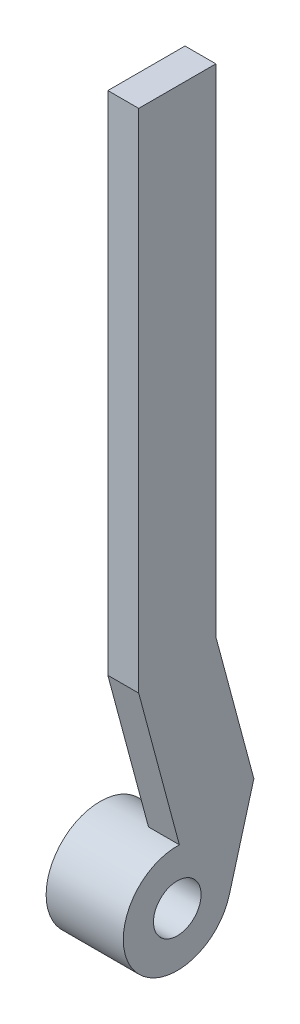
ISO-10303-21;
HEADER;
FILE_DESCRIPTION(('STEP AP214'),'2;1');
FILE_NAME('part.step','',(''),(''),'','','');
FILE_SCHEMA(('AUTOMOTIVE_DESIGN { 1 0 10303 214 1 1 1 1 }'));
ENDSEC;
DATA;
#1=APPLICATION_CONTEXT('core data for automotive mechanical design processes');
#2=APPLICATION_PROTOCOL_DEFINITION('international standard','automotive_design',2000,#1);
#3=PRODUCT_CONTEXT('',#1,'mechanical');
#4=PRODUCT('Part','Part','',(#3));
#5=PRODUCT_RELATED_PRODUCT_CATEGORY('part','',(#4));
#6=PRODUCT_DEFINITION_FORMATION('','',#4);
#7=PRODUCT_DEFINITION_CONTEXT('part definition',#1,'design');
#8=PRODUCT_DEFINITION('design','',#6,#7);
#9=PRODUCT_DEFINITION_SHAPE('','',#8);
#10=(LENGTH_UNIT() NAMED_UNIT(*) SI_UNIT(.MILLI.,.METRE.));
#11=(NAMED_UNIT(*) PLANE_ANGLE_UNIT() SI_UNIT($,.RADIAN.));
#12=(NAMED_UNIT(*) SI_UNIT($,.STERADIAN.) SOLID_ANGLE_UNIT());
#13=UNCERTAINTY_MEASURE_WITH_UNIT(LENGTH_MEASURE(1.E-05),#10,'distance_accuracy_value','');
#14=(GEOMETRIC_REPRESENTATION_CONTEXT(3) GLOBAL_UNCERTAINTY_ASSIGNED_CONTEXT((#13)) GLOBAL_UNIT_ASSIGNED_CONTEXT((#10,
#11,#12)) REPRESENTATION_CONTEXT('',''));
#15=CARTESIAN_POINT('',(0.,0.,0.));
#16=DIRECTION('',(0.,0.,1.));
#17=DIRECTION('',(1.,0.,0.));
#18=AXIS2_PLACEMENT_3D('',#15,#16,#17);
#19=CARTESIAN_POINT('',(-30.145,0.,0.));
#20=DIRECTION('',(1.,0.,0.));
#21=DIRECTION('',(0.,0.,-1.));
#22=AXIS2_PLACEMENT_3D('',#19,#20,#21);
#23=CYLINDRICAL_SURFACE('',#22,7.);
#24=CARTESIAN_POINT('',(-30.145,0.,0.));
#25=DIRECTION('',(-1.,0.,0.));
#26=DIRECTION('',(0.,0.,1.));
#27=AXIS2_PLACEMENT_3D('',#24,#25,#26);
#28=CIRCLE('',#27,7.);
#29=CARTESIAN_POINT('',(-30.145,0.,7.));
#30=VERTEX_POINT('',#29);
#31=EDGE_CURVE('E11',#30,#30,#28,.T.);
#32=ORIENTED_EDGE('',*,*,#31,.F.);
#33=EDGE_LOOP('',(#32));
#34=FACE_BOUND('',#33,.T.);
#35=DIRECTION('',(1.,0.,0.));
#36=VECTOR('',#35,1.);
#37=CARTESIAN_POINT('',(-24.145,6.99491771434268,-0.266694899791794));
#38=LINE('',#37,#36);
#39=CARTESIAN_POINT('',(-24.145,6.99491771434268,-0.266694899791794));
#40=VERTEX_POINT('',#39);
#41=CARTESIAN_POINT('',(-20.145,6.99491771434268,-0.266694899791793));
#42=VERTEX_POINT('',#41);
#43=EDGE_CURVE('E56',#40,#42,#38,.T.);
#44=ORIENTED_EDGE('',*,*,#43,.F.);
#45=CARTESIAN_POINT('',(-24.145,0.,0.));
#46=DIRECTION('',(-1.,0.,0.));
#47=DIRECTION('',(0.,0.,1.));
#48=AXIS2_PLACEMENT_3D('',#45,#46,#47);
#49=CIRCLE('',#48,7.);
#50=CARTESIAN_POINT('',(-24.145,-1.87292477240286,-6.74478708314204));
#51=VERTEX_POINT('',#50);
#52=EDGE_CURVE('E51',#40,#51,#49,.T.);
#53=ORIENTED_EDGE('',*,*,#52,.T.);
#54=DIRECTION('',(1.,0.,0.));
#55=VECTOR('',#54,1.);
#56=CARTESIAN_POINT('',(-24.145,-1.87292477240286,-6.74478708314204));
#57=LINE('',#56,#55);
#58=CARTESIAN_POINT('',(-20.145,-1.87292477240286,-6.74478708314204));
#59=VERTEX_POINT('',#58);
#60=EDGE_CURVE('E124',#51,#59,#57,.T.);
#61=ORIENTED_EDGE('',*,*,#60,.T.);
#62=CARTESIAN_POINT('',(-20.145,0.,0.));
#63=DIRECTION('',(-1.,0.,0.));
#64=DIRECTION('',(0.,0.,1.));
#65=AXIS2_PLACEMENT_3D('',#62,#63,#64);
#66=CIRCLE('',#65,7.);
#67=EDGE_CURVE('E39',#59,#42,#66,.T.);
#68=ORIENTED_EDGE('',*,*,#67,.T.);
#69=EDGE_LOOP('',(#44,#53,#61,#68));
#70=FACE_BOUND('',#69,.T.);
#71=ADVANCED_FACE('F35',(#34,#70),#23,.T.);
#72=CARTESIAN_POINT('',(-30.145,0.,0.));
#73=DIRECTION('',(1.,0.,0.));
#74=DIRECTION('',(0.,0.,-1.));
#75=AXIS2_PLACEMENT_3D('',#72,#73,#74);
#76=CYLINDRICAL_SURFACE('',#75,3.0845);
#77=CARTESIAN_POINT('',(-20.145,0.,0.));
#78=DIRECTION('',(-1.,0.,0.));
#79=DIRECTION('',(0.,0.,1.));
#80=AXIS2_PLACEMENT_3D('',#77,#78,#79);
#81=CIRCLE('',#80,3.0845);
#82=CARTESIAN_POINT('',(-20.145,0.,3.0845));
#83=VERTEX_POINT('',#82);
#84=EDGE_CURVE('E151',#83,#83,#81,.T.);
#85=ORIENTED_EDGE('',*,*,#84,.F.);
#86=EDGE_LOOP('',(#85));
#87=FACE_BOUND('',#86,.T.);
#88=CARTESIAN_POINT('',(-27.145,0.,0.));
#89=DIRECTION('',(-1.,0.,0.));
#90=DIRECTION('',(0.,0.,1.));
#91=AXIS2_PLACEMENT_3D('',#88,#89,#90);
#92=CIRCLE('',#91,3.0845);
#93=CARTESIAN_POINT('',(-27.145,0.,3.0845));
#94=VERTEX_POINT('',#93);
#95=EDGE_CURVE('E149',#94,#94,#92,.T.);
#96=ORIENTED_EDGE('',*,*,#95,.T.);
#97=EDGE_LOOP('',(#96));
#98=FACE_BOUND('',#97,.T.);
#99=ADVANCED_FACE('F37',(#87,#98),#76,.F.);
#100=CARTESIAN_POINT('',(-30.145,0.,0.));
#101=DIRECTION('',(-1.,0.,0.));
#102=DIRECTION('',(0.,0.,1.));
#103=AXIS2_PLACEMENT_3D('',#100,#101,#102);
#104=PLANE('',#103);
#105=ORIENTED_EDGE('',*,*,#31,.T.);
#106=EDGE_LOOP('',(#105));
#107=FACE_BOUND('',#106,.T.);
#108=ADVANCED_FACE('F189',(#107),#104,.T.);
#109=CARTESIAN_POINT('',(-20.145,0.,0.));
#110=DIRECTION('',(-1.,0.,0.));
#111=DIRECTION('',(0.,0.,1.));
#112=AXIS2_PLACEMENT_3D('',#109,#110,#111);
#113=PLANE('',#112);
#114=ORIENTED_EDGE('',*,*,#84,.T.);
#115=EDGE_LOOP('',(#114));
#116=FACE_BOUND('',#115,.T.);
#117=ORIENTED_EDGE('',*,*,#67,.F.);
#118=DIRECTION('',(0.,-0.963541011877434,0.267560681771837));
#119=VECTOR('',#118,1.);
#120=CARTESIAN_POINT('',(-20.145,-1.87292477240286,-6.74478708314204));
#121=LINE('',#120,#119);
#122=CARTESIAN_POINT('',(-20.145,9.5831081653679,-9.92595316268248));
#123=VERTEX_POINT('',#122);
#124=EDGE_CURVE('E134',#123,#59,#121,.T.);
#125=ORIENTED_EDGE('',*,*,#124,.F.);
#126=DIRECTION('',(0.,-0.965925826289068,-0.258819045102522));
#127=VECTOR('',#126,1.);
#128=CARTESIAN_POINT('',(-20.145,3.12343481414324,-11.656817420512));
#129=LINE('',#128,#127);
#130=CARTESIAN_POINT('',(-20.145,27.9670156442034,-5.));
#131=VERTEX_POINT('',#130);
#132=EDGE_CURVE('E132',#131,#123,#129,.T.);
#133=ORIENTED_EDGE('',*,*,#132,.F.);
#134=DIRECTION('',(0.,-1.,0.));
#135=VECTOR('',#134,1.);
#136=CARTESIAN_POINT('',(-20.145,0.,-5.));
#137=LINE('',#136,#135);
#138=CARTESIAN_POINT('',(-20.145,92.2878720852358,-5.));
#139=VERTEX_POINT('',#138);
#140=EDGE_CURVE('E130',#139,#131,#137,.T.);
#141=ORIENTED_EDGE('',*,*,#140,.F.);
#142=DIRECTION('',(0.,0.,-1.));
#143=VECTOR('',#142,1.);
#144=CARTESIAN_POINT('',(-20.145,92.2878720852358,0.));
#145=LINE('',#144,#143);
#146=CARTESIAN_POINT('',(-20.145,92.2878720852358,5.));
#147=VERTEX_POINT('',#146);
#148=EDGE_CURVE('E128',#147,#139,#145,.T.);
#149=ORIENTED_EDGE('',*,*,#148,.F.);
#150=DIRECTION('',(0.,1.,0.));
#151=VECTOR('',#150,1.);
#152=CARTESIAN_POINT('',(-20.145,0.,4.99999999999999));
#153=LINE('',#152,#151);
#154=CARTESIAN_POINT('',(-20.145,26.6504906683294,4.99999999999999));
#155=VERTEX_POINT('',#154);
#156=EDGE_CURVE('E126',#155,#147,#153,.T.);
#157=ORIENTED_EDGE('',*,*,#156,.F.);
#158=DIRECTION('',(0.,0.965925826289068,0.258819045102522));
#159=VECTOR('',#158,1.);
#160=CARTESIAN_POINT('',(-20.145,0.535244363118021,-1.99755915762129));
#161=LINE('',#160,#159);
#162=EDGE_CURVE('E105',#42,#155,#161,.T.);
#163=ORIENTED_EDGE('',*,*,#162,.F.);
#164=EDGE_LOOP('',(#117,#125,#133,#141,#149,#157,#163));
#165=FACE_BOUND('',#164,.T.);
#166=ADVANCED_FACE('F158',(#116,#165),#113,.F.);
#167=CARTESIAN_POINT('',(-27.145,0.,0.));
#168=DIRECTION('',(-1.,0.,0.));
#169=DIRECTION('',(0.,0.,1.));
#170=AXIS2_PLACEMENT_3D('',#167,#168,#169);
#171=PLANE('',#170);
#172=ORIENTED_EDGE('',*,*,#95,.F.);
#173=EDGE_LOOP('',(#172));
#174=FACE_BOUND('',#173,.T.);
#175=ADVANCED_FACE('F195',(#174),#171,.F.);
#176=CARTESIAN_POINT('',(-24.145,0.535244363118021,-1.99755915762129));
#177=DIRECTION('',(0.,0.258819045102522,-0.965925826289068));
#178=DIRECTION('',(0.,0.965925826289068,0.258819045102522));
#179=AXIS2_PLACEMENT_3D('',#176,#177,#178);
#180=PLANE('',#179);
#181=ORIENTED_EDGE('',*,*,#162,.T.);
#182=DIRECTION('',(1.,0.,0.));
#183=VECTOR('',#182,1.);
#184=CARTESIAN_POINT('',(-24.145,26.6504906683294,4.99999999999999));
#185=LINE('',#184,#183);
#186=CARTESIAN_POINT('',(-24.145,26.6504906683294,4.99999999999999));
#187=VERTEX_POINT('',#186);
#188=EDGE_CURVE('E102',#187,#155,#185,.T.);
#189=ORIENTED_EDGE('',*,*,#188,.F.);
#190=DIRECTION('',(0.,0.965925826289068,0.258819045102522));
#191=VECTOR('',#190,1.);
#192=CARTESIAN_POINT('',(-24.145,0.535244363118021,-1.99755915762129));
#193=LINE('',#192,#191);
#194=EDGE_CURVE('E93',#40,#187,#193,.T.);
#195=ORIENTED_EDGE('',*,*,#194,.F.);
#196=ORIENTED_EDGE('',*,*,#43,.T.);
#197=EDGE_LOOP('',(#181,#189,#195,#196));
#198=FACE_BOUND('',#197,.T.);
#199=ADVANCED_FACE('F103',(#198),#180,.F.);
#200=CARTESIAN_POINT('',(-24.145,0.,4.99999999999999));
#201=DIRECTION('',(0.,0.,-1.));
#202=DIRECTION('',(0.,1.,0.));
#203=AXIS2_PLACEMENT_3D('',#200,#201,#202);
#204=PLANE('',#203);
#205=ORIENTED_EDGE('',*,*,#156,.T.);
#206=DIRECTION('',(1.,0.,0.));
#207=VECTOR('',#206,1.);
#208=CARTESIAN_POINT('',(-24.145,92.2878720852358,5.));
#209=LINE('',#208,#207);
#210=CARTESIAN_POINT('',(-24.145,92.2878720852358,5.));
#211=VERTEX_POINT('',#210);
#212=EDGE_CURVE('E108',#211,#147,#209,.T.);
#213=ORIENTED_EDGE('',*,*,#212,.F.);
#214=DIRECTION('',(0.,1.,0.));
#215=VECTOR('',#214,1.);
#216=CARTESIAN_POINT('',(-24.145,0.,4.99999999999999));
#217=LINE('',#216,#215);
#218=EDGE_CURVE('E97',#187,#211,#217,.T.);
#219=ORIENTED_EDGE('',*,*,#218,.F.);
#220=ORIENTED_EDGE('',*,*,#188,.T.);
#221=EDGE_LOOP('',(#205,#213,#219,#220));
#222=FACE_BOUND('',#221,.T.);
#223=ADVANCED_FACE('F110',(#222),#204,.F.);
#224=CARTESIAN_POINT('',(-24.145,92.2878720852358,0.));
#225=DIRECTION('',(0.,-1.,0.));
#226=DIRECTION('',(1.,0.,0.));
#227=AXIS2_PLACEMENT_3D('',#224,#225,#226);
#228=PLANE('',#227);
#229=ORIENTED_EDGE('',*,*,#148,.T.);
#230=DIRECTION('',(1.,0.,0.));
#231=VECTOR('',#230,1.);
#232=CARTESIAN_POINT('',(-24.145,92.2878720852358,-5.));
#233=LINE('',#232,#231);
#234=CARTESIAN_POINT('',(-24.145,92.2878720852358,-5.));
#235=VERTEX_POINT('',#234);
#236=EDGE_CURVE('E144',#235,#139,#233,.T.);
#237=ORIENTED_EDGE('',*,*,#236,.F.);
#238=DIRECTION('',(0.,0.,-1.));
#239=VECTOR('',#238,1.);
#240=CARTESIAN_POINT('',(-24.145,92.2878720852358,0.));
#241=LINE('',#240,#239);
#242=EDGE_CURVE('E113',#211,#235,#241,.T.);
#243=ORIENTED_EDGE('',*,*,#242,.F.);
#244=ORIENTED_EDGE('',*,*,#212,.T.);
#245=EDGE_LOOP('',(#229,#237,#243,#244));
#246=FACE_BOUND('',#245,.T.);
#247=ADVANCED_FACE('F162',(#246),#228,.F.);
#248=CARTESIAN_POINT('',(-24.145,0.,-5.));
#249=DIRECTION('',(0.,0.,1.));
#250=DIRECTION('',(1.,0.,0.));
#251=AXIS2_PLACEMENT_3D('',#248,#249,#250);
#252=PLANE('',#251);
#253=ORIENTED_EDGE('',*,*,#140,.T.);
#254=DIRECTION('',(1.,0.,0.));
#255=VECTOR('',#254,1.);
#256=CARTESIAN_POINT('',(-24.145,27.9670156442034,-5.));
#257=LINE('',#256,#255);
#258=CARTESIAN_POINT('',(-24.145,27.9670156442034,-5.));
#259=VERTEX_POINT('',#258);
#260=EDGE_CURVE('E141',#259,#131,#257,.T.);
#261=ORIENTED_EDGE('',*,*,#260,.F.);
#262=DIRECTION('',(0.,-1.,0.));
#263=VECTOR('',#262,1.);
#264=CARTESIAN_POINT('',(-24.145,0.,-5.));
#265=LINE('',#264,#263);
#266=EDGE_CURVE('E115',#235,#259,#265,.T.);
#267=ORIENTED_EDGE('',*,*,#266,.F.);
#268=ORIENTED_EDGE('',*,*,#236,.T.);
#269=EDGE_LOOP('',(#253,#261,#267,#268));
#270=FACE_BOUND('',#269,.T.);
#271=ADVANCED_FACE('F169',(#270),#252,.F.);
#272=CARTESIAN_POINT('',(-24.145,3.12343481414324,-11.656817420512));
#273=DIRECTION('',(0.,-0.258819045102521,0.965925826289068));
#274=DIRECTION('',(0.,-0.965925826289068,-0.258819045102521));
#275=AXIS2_PLACEMENT_3D('',#272,#273,#274);
#276=PLANE('',#275);
#277=ORIENTED_EDGE('',*,*,#132,.T.);
#278=DIRECTION('',(1.,0.,0.));
#279=VECTOR('',#278,1.);
#280=CARTESIAN_POINT('',(-24.145,9.5831081653679,-9.92595316268248));
#281=LINE('',#280,#279);
#282=CARTESIAN_POINT('',(-24.145,9.5831081653679,-9.92595316268248));
#283=VERTEX_POINT('',#282);
#284=EDGE_CURVE('E138',#283,#123,#281,.T.);
#285=ORIENTED_EDGE('',*,*,#284,.F.);
#286=DIRECTION('',(0.,-0.965925826289068,-0.258819045102522));
#287=VECTOR('',#286,1.);
#288=CARTESIAN_POINT('',(-24.145,3.12343481414324,-11.656817420512));
#289=LINE('',#288,#287);
#290=EDGE_CURVE('E120',#259,#283,#289,.T.);
#291=ORIENTED_EDGE('',*,*,#290,.F.);
#292=ORIENTED_EDGE('',*,*,#260,.T.);
#293=EDGE_LOOP('',(#277,#285,#291,#292));
#294=FACE_BOUND('',#293,.T.);
#295=ADVANCED_FACE('F172',(#294),#276,.F.);
#296=CARTESIAN_POINT('',(-24.145,-1.87292477240286,-6.74478708314204));
#297=DIRECTION('',(0.,0.267560681771837,0.963541011877434));
#298=DIRECTION('',(0.,-0.963541011877434,0.267560681771837));
#299=AXIS2_PLACEMENT_3D('',#296,#297,#298);
#300=PLANE('',#299);
#301=ORIENTED_EDGE('',*,*,#124,.T.);
#302=ORIENTED_EDGE('',*,*,#60,.F.);
#303=DIRECTION('',(0.,-0.963541011877434,0.267560681771837));
#304=VECTOR('',#303,1.);
#305=CARTESIAN_POINT('',(-24.145,-1.87292477240286,-6.74478708314204));
#306=LINE('',#305,#304);
#307=EDGE_CURVE('E122',#283,#51,#306,.T.);
#308=ORIENTED_EDGE('',*,*,#307,.F.);
#309=ORIENTED_EDGE('',*,*,#284,.T.);
#310=EDGE_LOOP('',(#301,#302,#308,#309));
#311=FACE_BOUND('',#310,.T.);
#312=ADVANCED_FACE('F175',(#311),#300,.F.);
#313=CARTESIAN_POINT('',(-24.145,0.,0.));
#314=DIRECTION('',(-1.,0.,0.));
#315=DIRECTION('',(0.,0.,1.));
#316=AXIS2_PLACEMENT_3D('',#313,#314,#315);
#317=PLANE('',#316);
#318=ORIENTED_EDGE('',*,*,#52,.F.);
#319=ORIENTED_EDGE('',*,*,#194,.T.);
#320=ORIENTED_EDGE('',*,*,#218,.T.);
#321=ORIENTED_EDGE('',*,*,#242,.T.);
#322=ORIENTED_EDGE('',*,*,#266,.T.);
#323=ORIENTED_EDGE('',*,*,#290,.T.);
#324=ORIENTED_EDGE('',*,*,#307,.T.);
#325=EDGE_LOOP('',(#318,#319,#320,#321,#322,#323,#324));
#326=FACE_BOUND('',#325,.T.);
#327=ADVANCED_FACE('F95',(#326),#317,.T.);
#328=CLOSED_SHELL('',(#71,#99,#108,#166,#175,#199,#223,#247,#271,#295,#312,#327));
#329=MANIFOLD_SOLID_BREP('B2',#328);
#330=ADVANCED_BREP_SHAPE_REPRESENTATION('',(#18,#329),#14);
#331=SHAPE_DEFINITION_REPRESENTATION(#9,#330);
ENDSEC;
END-ISO-10303-21;
